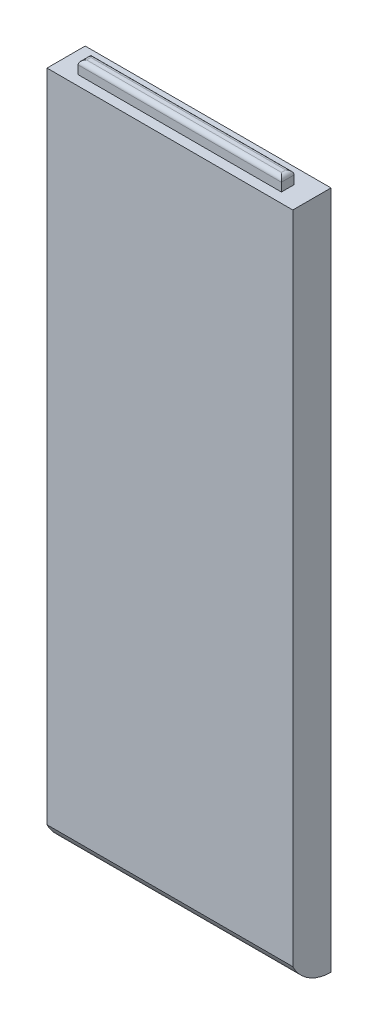
ISO-10303-21;
HEADER;
FILE_DESCRIPTION(('STEP AP214'),'2;1');
FILE_NAME('part.step','',(''),(''),'','','');
FILE_SCHEMA(('AUTOMOTIVE_DESIGN { 1 0 10303 214 1 1 1 1 }'));
ENDSEC;
DATA;
#1=APPLICATION_CONTEXT('core data for automotive mechanical design processes');
#2=APPLICATION_PROTOCOL_DEFINITION('international standard','automotive_design',2000,#1);
#3=PRODUCT_CONTEXT('',#1,'mechanical');
#4=PRODUCT('Part','Part','',(#3));
#5=PRODUCT_RELATED_PRODUCT_CATEGORY('part','',(#4));
#6=PRODUCT_DEFINITION_FORMATION('','',#4);
#7=PRODUCT_DEFINITION_CONTEXT('part definition',#1,'design');
#8=PRODUCT_DEFINITION('design','',#6,#7);
#9=PRODUCT_DEFINITION_SHAPE('','',#8);
#10=(LENGTH_UNIT() NAMED_UNIT(*) SI_UNIT(.MILLI.,.METRE.));
#11=(NAMED_UNIT(*) PLANE_ANGLE_UNIT() SI_UNIT($,.RADIAN.));
#12=(NAMED_UNIT(*) SI_UNIT($,.STERADIAN.) SOLID_ANGLE_UNIT());
#13=UNCERTAINTY_MEASURE_WITH_UNIT(LENGTH_MEASURE(1.E-05),#10,'distance_accuracy_value','');
#14=(GEOMETRIC_REPRESENTATION_CONTEXT(3) GLOBAL_UNCERTAINTY_ASSIGNED_CONTEXT((#13)) GLOBAL_UNIT_ASSIGNED_CONTEXT((#10,
#11,#12)) REPRESENTATION_CONTEXT('',''));
#15=CARTESIAN_POINT('',(0.,0.,0.));
#16=DIRECTION('',(0.,0.,1.));
#17=DIRECTION('',(1.,0.,0.));
#18=AXIS2_PLACEMENT_3D('',#15,#16,#17);
#19=CARTESIAN_POINT('',(0.,160.,10.));
#20=DIRECTION('',(0.,-1.,0.));
#21=DIRECTION('',(0.,0.,-1.));
#22=AXIS2_PLACEMENT_3D('',#19,#20,#21);
#23=PLANE('',#22);
#24=DIRECTION('',(0.,0.,1.));
#25=VECTOR('',#24,1.);
#26=CARTESIAN_POINT('',(4.99999999999997,160.,3.68090741163309));
#27=LINE('',#26,#25);
#28=CARTESIAN_POINT('',(4.99999999999997,160.,3.68090741163309));
#29=VERTEX_POINT('',#28);
#30=CARTESIAN_POINT('',(4.99999999999997,160.,6.68090741163309));
#31=VERTEX_POINT('',#30);
#32=EDGE_CURVE('E233',#29,#31,#27,.T.);
#33=ORIENTED_EDGE('',*,*,#32,.F.);
#34=DIRECTION('',(-1.,0.,0.));
#35=VECTOR('',#34,1.);
#36=CARTESIAN_POINT('',(4.99999999999997,160.,3.68090741163309));
#37=LINE('',#36,#35);
#38=CARTESIAN_POINT('',(52.9,160.,3.68090741163309));
#39=VERTEX_POINT('',#38);
#40=EDGE_CURVE('E248',#39,#29,#37,.T.);
#41=ORIENTED_EDGE('',*,*,#40,.F.);
#42=DIRECTION('',(0.,0.,-1.));
#43=VECTOR('',#42,1.);
#44=CARTESIAN_POINT('',(52.9,160.,3.68090741163309));
#45=LINE('',#44,#43);
#46=CARTESIAN_POINT('',(52.9,160.,6.68090741163309));
#47=VERTEX_POINT('',#46);
#48=EDGE_CURVE('E243',#47,#39,#45,.T.);
#49=ORIENTED_EDGE('',*,*,#48,.F.);
#50=DIRECTION('',(1.,0.,0.));
#51=VECTOR('',#50,1.);
#52=CARTESIAN_POINT('',(4.99999999999997,160.,6.68090741163309));
#53=LINE('',#52,#51);
#54=EDGE_CURVE('E238',#31,#47,#53,.T.);
#55=ORIENTED_EDGE('',*,*,#54,.F.);
#56=EDGE_LOOP('',(#33,#41,#49,#55));
#57=FACE_BOUND('',#56,.T.);
#58=DIRECTION('',(-1.,0.,0.));
#59=VECTOR('',#58,1.);
#60=CARTESIAN_POINT('',(0.,160.,9.));
#61=LINE('',#60,#59);
#62=CARTESIAN_POINT('',(57.9,160.,9.));
#63=VERTEX_POINT('',#62);
#64=CARTESIAN_POINT('',(0.,160.,9.));
#65=VERTEX_POINT('',#64);
#66=EDGE_CURVE('E152',#63,#65,#61,.T.);
#67=ORIENTED_EDGE('',*,*,#66,.F.);
#68=DIRECTION('',(0.,0.,-1.));
#69=VECTOR('',#68,1.);
#70=CARTESIAN_POINT('',(57.9,160.,10.));
#71=LINE('',#70,#69);
#72=CARTESIAN_POINT('',(57.9,160.,0.));
#73=VERTEX_POINT('',#72);
#74=EDGE_CURVE('E160',#63,#73,#71,.T.);
#75=ORIENTED_EDGE('',*,*,#74,.T.);
#76=DIRECTION('',(-1.,0.,0.));
#77=VECTOR('',#76,1.);
#78=CARTESIAN_POINT('',(0.,160.,0.));
#79=LINE('',#78,#77);
#80=CARTESIAN_POINT('',(0.,160.,0.));
#81=VERTEX_POINT('',#80);
#82=EDGE_CURVE('E173',#73,#81,#79,.T.);
#83=ORIENTED_EDGE('',*,*,#82,.T.);
#84=DIRECTION('',(0.,0.,-1.));
#85=VECTOR('',#84,1.);
#86=CARTESIAN_POINT('',(0.,160.,10.));
#87=LINE('',#86,#85);
#88=EDGE_CURVE('E162',#65,#81,#87,.T.);
#89=ORIENTED_EDGE('',*,*,#88,.F.);
#90=EDGE_LOOP('',(#67,#75,#83,#89));
#91=FACE_BOUND('',#90,.T.);
#92=ADVANCED_FACE('F39',(#57,#91),#23,.F.);
#93=CARTESIAN_POINT('',(0.,0.,10.));
#94=DIRECTION('',(1.,0.,0.));
#95=DIRECTION('',(0.,1.,0.));
#96=AXIS2_PLACEMENT_3D('',#93,#94,#95);
#97=PLANE('',#96);
#98=DIRECTION('',(0.,-1.,0.));
#99=VECTOR('',#98,1.);
#100=CARTESIAN_POINT('',(0.,160.,9.));
#101=LINE('',#100,#99);
#102=CARTESIAN_POINT('',(0.,5.64110105645933,9.));
#103=VERTEX_POINT('',#102);
#104=EDGE_CURVE('E54',#65,#103,#101,.T.);
#105=ORIENTED_EDGE('',*,*,#104,.F.);
#106=ORIENTED_EDGE('',*,*,#88,.T.);
#107=DIRECTION('',(0.,-1.,0.));
#108=VECTOR('',#107,1.);
#109=CARTESIAN_POINT('',(0.,0.,0.));
#110=LINE('',#109,#108);
#111=CARTESIAN_POINT('',(0.,0.,0.));
#112=VERTEX_POINT('',#111);
#113=EDGE_CURVE('E277',#81,#112,#110,.T.);
#114=ORIENTED_EDGE('',*,*,#113,.T.);
#115=CARTESIAN_POINT('',(0.,10.,0.));
#116=DIRECTION('',(1.,0.,0.));
#117=DIRECTION('',(0.,1.,0.));
#118=AXIS2_PLACEMENT_3D('',#115,#116,#117);
#119=CIRCLE('',#118,10.);
#120=EDGE_CURVE('E171',#112,#103,#119,.F.);
#121=ORIENTED_EDGE('',*,*,#120,.T.);
#122=EDGE_LOOP('',(#105,#106,#114,#121));
#123=FACE_BOUND('',#122,.T.);
#124=ADVANCED_FACE('F289',(#123),#97,.F.);
#125=CARTESIAN_POINT('',(57.9,0.,10.));
#126=DIRECTION('',(-1.,0.,0.));
#127=DIRECTION('',(0.,-1.,0.));
#128=AXIS2_PLACEMENT_3D('',#125,#126,#127);
#129=PLANE('',#128);
#130=DIRECTION('',(0.,1.,0.));
#131=VECTOR('',#130,1.);
#132=CARTESIAN_POINT('',(57.9,160.,9.));
#133=LINE('',#132,#131);
#134=CARTESIAN_POINT('',(57.9,5.64110105645932,9.));
#135=VERTEX_POINT('',#134);
#136=EDGE_CURVE('E149',#135,#63,#133,.T.);
#137=ORIENTED_EDGE('',*,*,#136,.F.);
#138=CARTESIAN_POINT('',(57.9,10.,0.));
#139=DIRECTION('',(-1.,0.,0.));
#140=DIRECTION('',(0.,-1.,0.));
#141=AXIS2_PLACEMENT_3D('',#138,#139,#140);
#142=CIRCLE('',#141,10.);
#143=CARTESIAN_POINT('',(57.9,0.,0.));
#144=VERTEX_POINT('',#143);
#145=EDGE_CURVE('E169',#135,#144,#142,.F.);
#146=ORIENTED_EDGE('',*,*,#145,.T.);
#147=DIRECTION('',(0.,1.,0.));
#148=VECTOR('',#147,1.);
#149=CARTESIAN_POINT('',(57.9,0.,0.));
#150=LINE('',#149,#148);
#151=EDGE_CURVE('E167',#144,#73,#150,.T.);
#152=ORIENTED_EDGE('',*,*,#151,.T.);
#153=ORIENTED_EDGE('',*,*,#74,.F.);
#154=EDGE_LOOP('',(#137,#146,#152,#153));
#155=FACE_BOUND('',#154,.T.);
#156=ADVANCED_FACE('F165',(#155),#129,.F.);
#157=CARTESIAN_POINT('',(0.,10.,0.));
#158=DIRECTION('',(1.,0.,0.));
#159=DIRECTION('',(0.,0.,-1.));
#160=AXIS2_PLACEMENT_3D('',#157,#158,#159);
#161=CYLINDRICAL_SURFACE('',#160,10.);
#162=ORIENTED_EDGE('',*,*,#145,.F.);
#163=DIRECTION('',(1.,0.,0.));
#164=VECTOR('',#163,1.);
#165=CARTESIAN_POINT('',(0.,5.64110105645933,9.));
#166=LINE('',#165,#164);
#167=EDGE_CURVE('E11',#135,#103,#166,.F.);
#168=ORIENTED_EDGE('',*,*,#167,.T.);
#169=ORIENTED_EDGE('',*,*,#120,.F.);
#170=DIRECTION('',(1.,0.,0.));
#171=VECTOR('',#170,1.);
#172=CARTESIAN_POINT('',(0.,0.,0.));
#173=LINE('',#172,#171);
#174=EDGE_CURVE('E280',#112,#144,#173,.T.);
#175=ORIENTED_EDGE('',*,*,#174,.T.);
#176=EDGE_LOOP('',(#162,#168,#169,#175));
#177=FACE_BOUND('',#176,.T.);
#178=ADVANCED_FACE('F291',(#177),#161,.T.);
#179=CARTESIAN_POINT('',(0.,0.,0.));
#180=DIRECTION('',(0.,0.,-1.));
#181=DIRECTION('',(-1.,0.,0.));
#182=AXIS2_PLACEMENT_3D('',#179,#180,#181);
#183=PLANE('',#182);
#184=ORIENTED_EDGE('',*,*,#113,.F.);
#185=ORIENTED_EDGE('',*,*,#82,.F.);
#186=ORIENTED_EDGE('',*,*,#151,.F.);
#187=ORIENTED_EDGE('',*,*,#174,.F.);
#188=EDGE_LOOP('',(#184,#185,#186,#187));
#189=FACE_BOUND('',#188,.T.);
#190=DIRECTION('',(-1.,0.,0.));
#191=VECTOR('',#190,1.);
#192=CARTESIAN_POINT('',(52.9,1.35,0.));
#193=LINE('',#192,#191);
#194=CARTESIAN_POINT('',(52.9,1.35,0.));
#195=VERTEX_POINT('',#194);
#196=CARTESIAN_POINT('',(4.99999999999997,1.35,0.));
#197=VERTEX_POINT('',#196);
#198=EDGE_CURVE('E260',#195,#197,#193,.T.);
#199=ORIENTED_EDGE('',*,*,#198,.F.);
#200=DIRECTION('',(0.,-1.,0.));
#201=VECTOR('',#200,1.);
#202=CARTESIAN_POINT('',(52.9,3.65,0.));
#203=LINE('',#202,#201);
#204=CARTESIAN_POINT('',(52.9,3.65,0.));
#205=VERTEX_POINT('',#204);
#206=EDGE_CURVE('E209',#205,#195,#203,.T.);
#207=ORIENTED_EDGE('',*,*,#206,.F.);
#208=DIRECTION('',(1.,0.,0.));
#209=VECTOR('',#208,1.);
#210=CARTESIAN_POINT('',(52.9,3.65,0.));
#211=LINE('',#210,#209);
#212=CARTESIAN_POINT('',(4.99999999999997,3.65,0.));
#213=VERTEX_POINT('',#212);
#214=EDGE_CURVE('E266',#213,#205,#211,.T.);
#215=ORIENTED_EDGE('',*,*,#214,.F.);
#216=DIRECTION('',(0.,1.,0.));
#217=VECTOR('',#216,1.);
#218=CARTESIAN_POINT('',(4.99999999999997,3.65,0.));
#219=LINE('',#218,#217);
#220=EDGE_CURVE('E263',#197,#213,#219,.T.);
#221=ORIENTED_EDGE('',*,*,#220,.F.);
#222=EDGE_LOOP('',(#199,#207,#215,#221));
#223=FACE_BOUND('',#222,.T.);
#224=ADVANCED_FACE('F285',(#189,#223),#183,.T.);
#225=CARTESIAN_POINT('',(52.9,3.65,-3.));
#226=DIRECTION('',(-1.,0.,0.));
#227=DIRECTION('',(0.,0.,1.));
#228=AXIS2_PLACEMENT_3D('',#225,#226,#227);
#229=PLANE('',#228);
#230=DIRECTION('',(0.,0.,1.));
#231=VECTOR('',#230,1.);
#232=CARTESIAN_POINT('',(52.9,1.35,-3.));
#233=LINE('',#232,#231);
#234=CARTESIAN_POINT('',(52.9,1.35,-2.));
#235=VERTEX_POINT('',#234);
#236=EDGE_CURVE('E275',#235,#195,#233,.T.);
#237=ORIENTED_EDGE('',*,*,#236,.F.);
#238=DIRECTION('',(0.,-1.,0.));
#239=VECTOR('',#238,1.);
#240=CARTESIAN_POINT('',(52.9,3.65,-2.));
#241=LINE('',#240,#239);
#242=CARTESIAN_POINT('',(52.9,3.65,-2.));
#243=VERTEX_POINT('',#242);
#244=EDGE_CURVE('E193',#235,#243,#241,.F.);
#245=ORIENTED_EDGE('',*,*,#244,.T.);
#246=DIRECTION('',(0.,0.,1.));
#247=VECTOR('',#246,1.);
#248=CARTESIAN_POINT('',(52.9,3.65,-3.));
#249=LINE('',#248,#247);
#250=EDGE_CURVE('E269',#243,#205,#249,.T.);
#251=ORIENTED_EDGE('',*,*,#250,.T.);
#252=ORIENTED_EDGE('',*,*,#206,.T.);
#253=EDGE_LOOP('',(#237,#245,#251,#252));
#254=FACE_BOUND('',#253,.T.);
#255=ADVANCED_FACE('F299',(#254),#229,.F.);
#256=CARTESIAN_POINT('',(52.9,1.35,-3.));
#257=DIRECTION('',(0.,1.,0.));
#258=DIRECTION('',(0.,0.,1.));
#259=AXIS2_PLACEMENT_3D('',#256,#257,#258);
#260=PLANE('',#259);
#261=DIRECTION('',(0.,0.,1.));
#262=VECTOR('',#261,1.);
#263=CARTESIAN_POINT('',(4.99999999999997,1.35,-3.));
#264=LINE('',#263,#262);
#265=CARTESIAN_POINT('',(4.99999999999997,1.35,-2.));
#266=VERTEX_POINT('',#265);
#267=EDGE_CURVE('E273',#266,#197,#264,.T.);
#268=ORIENTED_EDGE('',*,*,#267,.F.);
#269=DIRECTION('',(-1.,0.,0.));
#270=VECTOR('',#269,1.);
#271=CARTESIAN_POINT('',(52.9,1.35,-2.));
#272=LINE('',#271,#270);
#273=EDGE_CURVE('E191',#266,#235,#272,.F.);
#274=ORIENTED_EDGE('',*,*,#273,.T.);
#275=ORIENTED_EDGE('',*,*,#236,.T.);
#276=ORIENTED_EDGE('',*,*,#198,.T.);
#277=EDGE_LOOP('',(#268,#274,#275,#276));
#278=FACE_BOUND('',#277,.T.);
#279=ADVANCED_FACE('F314',(#278),#260,.F.);
#280=CARTESIAN_POINT('',(4.99999999999997,3.65,-3.));
#281=DIRECTION('',(1.,0.,0.));
#282=DIRECTION('',(0.,1.,0.));
#283=AXIS2_PLACEMENT_3D('',#280,#281,#282);
#284=PLANE('',#283);
#285=DIRECTION('',(0.,0.,1.));
#286=VECTOR('',#285,1.);
#287=CARTESIAN_POINT('',(4.99999999999997,3.65,-3.));
#288=LINE('',#287,#286);
#289=CARTESIAN_POINT('',(4.99999999999997,3.65,-2.));
#290=VERTEX_POINT('',#289);
#291=EDGE_CURVE('E271',#290,#213,#288,.T.);
#292=ORIENTED_EDGE('',*,*,#291,.F.);
#293=DIRECTION('',(0.,1.,0.));
#294=VECTOR('',#293,1.);
#295=CARTESIAN_POINT('',(4.99999999999997,1.35,-2.));
#296=LINE('',#295,#294);
#297=EDGE_CURVE('E188',#290,#266,#296,.F.);
#298=ORIENTED_EDGE('',*,*,#297,.T.);
#299=ORIENTED_EDGE('',*,*,#267,.T.);
#300=ORIENTED_EDGE('',*,*,#220,.T.);
#301=EDGE_LOOP('',(#292,#298,#299,#300));
#302=FACE_BOUND('',#301,.T.);
#303=ADVANCED_FACE('F318',(#302),#284,.F.);
#304=CARTESIAN_POINT('',(52.9,3.65,-3.));
#305=DIRECTION('',(0.,-1.,0.));
#306=DIRECTION('',(1.,0.,0.));
#307=AXIS2_PLACEMENT_3D('',#304,#305,#306);
#308=PLANE('',#307);
#309=ORIENTED_EDGE('',*,*,#250,.F.);
#310=DIRECTION('',(1.,0.,0.));
#311=VECTOR('',#310,1.);
#312=CARTESIAN_POINT('',(4.99999999999997,3.65,-2.));
#313=LINE('',#312,#311);
#314=EDGE_CURVE('E195',#243,#290,#313,.F.);
#315=ORIENTED_EDGE('',*,*,#314,.T.);
#316=ORIENTED_EDGE('',*,*,#291,.T.);
#317=ORIENTED_EDGE('',*,*,#214,.T.);
#318=EDGE_LOOP('',(#309,#315,#316,#317));
#319=FACE_BOUND('',#318,.T.);
#320=ADVANCED_FACE('F322',(#319),#308,.F.);
#321=CARTESIAN_POINT('',(0.,0.,-3.));
#322=DIRECTION('',(0.,0.,-1.));
#323=DIRECTION('',(-1.,0.,0.));
#324=AXIS2_PLACEMENT_3D('',#321,#322,#323);
#325=PLANE('',#324);
#326=DIRECTION('',(-1.,0.,0.));
#327=VECTOR('',#326,1.);
#328=CARTESIAN_POINT('',(4.99999999999997,2.35,-3.));
#329=LINE('',#328,#327);
#330=CARTESIAN_POINT('',(51.9,2.35,-3.));
#331=VERTEX_POINT('',#330);
#332=CARTESIAN_POINT('',(5.99999999999997,2.35,-3.));
#333=VERTEX_POINT('',#332);
#334=EDGE_CURVE('E183',#331,#333,#329,.T.);
#335=ORIENTED_EDGE('',*,*,#334,.T.);
#336=DIRECTION('',(0.,1.,0.));
#337=VECTOR('',#336,1.);
#338=CARTESIAN_POINT('',(5.99999999999997,3.65,-3.));
#339=LINE('',#338,#337);
#340=CARTESIAN_POINT('',(5.99999999999997,2.65,-3.));
#341=VERTEX_POINT('',#340);
#342=EDGE_CURVE('E185',#333,#341,#339,.T.);
#343=ORIENTED_EDGE('',*,*,#342,.T.);
#344=DIRECTION('',(1.,0.,0.));
#345=VECTOR('',#344,1.);
#346=CARTESIAN_POINT('',(52.9,2.65,-3.));
#347=LINE('',#346,#345);
#348=CARTESIAN_POINT('',(51.9,2.65,-3.));
#349=VERTEX_POINT('',#348);
#350=EDGE_CURVE('E179',#341,#349,#347,.T.);
#351=ORIENTED_EDGE('',*,*,#350,.T.);
#352=DIRECTION('',(0.,-1.,0.));
#353=VECTOR('',#352,1.);
#354=CARTESIAN_POINT('',(51.9,1.35,-3.));
#355=LINE('',#354,#353);
#356=EDGE_CURVE('E181',#349,#331,#355,.T.);
#357=ORIENTED_EDGE('',*,*,#356,.T.);
#358=EDGE_LOOP('',(#335,#343,#351,#357));
#359=FACE_BOUND('',#358,.T.);
#360=ADVANCED_FACE('F326',(#359),#325,.T.);
#361=CARTESIAN_POINT('',(51.9,0.,-2.));
#362=DIRECTION('',(0.,1.,0.));
#363=DIRECTION('',(0.,0.,1.));
#364=AXIS2_PLACEMENT_3D('',#361,#362,#363);
#365=CYLINDRICAL_SURFACE('',#364,1.);
#366=CARTESIAN_POINT('',(51.9,2.65,-2.));
#367=DIRECTION('',(-0.707106781186547,0.707106781186547,0.));
#368=DIRECTION('',(-0.707106781186547,-0.707106781186547,0.));
#369=AXIS2_PLACEMENT_3D('',#366,#367,#368);
#370=ELLIPSE('',#369,1.41421356237309,1.);
#371=EDGE_CURVE('E203',#243,#349,#370,.T.);
#372=ORIENTED_EDGE('',*,*,#371,.F.);
#373=ORIENTED_EDGE('',*,*,#244,.F.);
#374=CARTESIAN_POINT('',(51.9,2.35,-2.));
#375=DIRECTION('',(0.707106781186547,0.707106781186547,0.));
#376=DIRECTION('',(-0.707106781186547,0.707106781186547,0.));
#377=AXIS2_PLACEMENT_3D('',#374,#375,#376);
#378=ELLIPSE('',#377,1.41421356237309,1.);
#379=EDGE_CURVE('E206',#331,#235,#378,.F.);
#380=ORIENTED_EDGE('',*,*,#379,.F.);
#381=ORIENTED_EDGE('',*,*,#356,.F.);
#382=EDGE_LOOP('',(#372,#373,#380,#381));
#383=FACE_BOUND('',#382,.T.);
#384=ADVANCED_FACE('F330',(#383),#365,.T.);
#385=CARTESIAN_POINT('',(0.,2.35,-2.));
#386=DIRECTION('',(1.,0.,0.));
#387=DIRECTION('',(0.,0.,-1.));
#388=AXIS2_PLACEMENT_3D('',#385,#386,#387);
#389=CYLINDRICAL_SURFACE('',#388,1.);
#390=ORIENTED_EDGE('',*,*,#379,.T.);
#391=ORIENTED_EDGE('',*,*,#273,.F.);
#392=CARTESIAN_POINT('',(5.99999999999997,2.35,-2.));
#393=DIRECTION('',(0.707106781186547,-0.707106781186548,0.));
#394=DIRECTION('',(0.707106781186548,0.707106781186547,0.));
#395=AXIS2_PLACEMENT_3D('',#392,#393,#394);
#396=ELLIPSE('',#395,1.4142135623731,1.);
#397=EDGE_CURVE('E200',#333,#266,#396,.F.);
#398=ORIENTED_EDGE('',*,*,#397,.F.);
#399=ORIENTED_EDGE('',*,*,#334,.F.);
#400=EDGE_LOOP('',(#390,#391,#398,#399));
#401=FACE_BOUND('',#400,.T.);
#402=ADVANCED_FACE('F426',(#401),#389,.T.);
#403=CARTESIAN_POINT('',(0.,2.65,-2.));
#404=DIRECTION('',(-1.,0.,0.));
#405=DIRECTION('',(0.,-1.,0.));
#406=AXIS2_PLACEMENT_3D('',#403,#404,#405);
#407=CYLINDRICAL_SURFACE('',#406,1.);
#408=ORIENTED_EDGE('',*,*,#371,.T.);
#409=ORIENTED_EDGE('',*,*,#350,.F.);
#410=CARTESIAN_POINT('',(5.99999999999997,2.65,-2.));
#411=DIRECTION('',(-0.707106781186548,-0.707106781186547,0.));
#412=DIRECTION('',(-0.707106781186547,0.707106781186548,0.));
#413=AXIS2_PLACEMENT_3D('',#410,#411,#412);
#414=ELLIPSE('',#413,1.41421356237309,1.);
#415=EDGE_CURVE('E198',#290,#341,#414,.T.);
#416=ORIENTED_EDGE('',*,*,#415,.F.);
#417=ORIENTED_EDGE('',*,*,#314,.F.);
#418=EDGE_LOOP('',(#408,#409,#416,#417));
#419=FACE_BOUND('',#418,.T.);
#420=ADVANCED_FACE('F418',(#419),#407,.T.);
#421=CARTESIAN_POINT('',(5.99999999999997,0.,-2.));
#422=DIRECTION('',(0.,-1.,0.));
#423=DIRECTION('',(1.,0.,0.));
#424=AXIS2_PLACEMENT_3D('',#421,#422,#423);
#425=CYLINDRICAL_SURFACE('',#424,1.);
#426=ORIENTED_EDGE('',*,*,#397,.T.);
#427=ORIENTED_EDGE('',*,*,#297,.F.);
#428=ORIENTED_EDGE('',*,*,#415,.T.);
#429=ORIENTED_EDGE('',*,*,#342,.F.);
#430=EDGE_LOOP('',(#426,#427,#428,#429));
#431=FACE_BOUND('',#430,.T.);
#432=ADVANCED_FACE('F336',(#431),#425,.T.);
#433=CARTESIAN_POINT('',(4.99999999999997,163.,3.68090741163309));
#434=DIRECTION('',(1.,0.,0.));
#435=DIRECTION('',(0.,0.,-1.));
#436=AXIS2_PLACEMENT_3D('',#433,#434,#435);
#437=PLANE('',#436);
#438=DIRECTION('',(0.,-1.,0.));
#439=VECTOR('',#438,1.);
#440=CARTESIAN_POINT('',(4.99999999999997,163.,6.68090741163309));
#441=LINE('',#440,#439);
#442=CARTESIAN_POINT('',(4.99999999999997,162.,6.68090741163309));
#443=VERTEX_POINT('',#442);
#444=EDGE_CURVE('E201',#443,#31,#441,.T.);
#445=ORIENTED_EDGE('',*,*,#444,.F.);
#446=DIRECTION('',(0.,0.,1.));
#447=VECTOR('',#446,1.);
#448=CARTESIAN_POINT('',(4.99999999999997,162.,3.68090741163309));
#449=LINE('',#448,#447);
#450=CARTESIAN_POINT('',(4.99999999999997,162.,3.68090741163309));
#451=VERTEX_POINT('',#450);
#452=EDGE_CURVE('E223',#443,#451,#449,.F.);
#453=ORIENTED_EDGE('',*,*,#452,.T.);
#454=DIRECTION('',(0.,-1.,0.));
#455=VECTOR('',#454,1.);
#456=CARTESIAN_POINT('',(4.99999999999997,163.,3.68090741163309));
#457=LINE('',#456,#455);
#458=EDGE_CURVE('E251',#451,#29,#457,.T.);
#459=ORIENTED_EDGE('',*,*,#458,.T.);
#460=ORIENTED_EDGE('',*,*,#32,.T.);
#461=EDGE_LOOP('',(#445,#453,#459,#460));
#462=FACE_BOUND('',#461,.T.);
#463=ADVANCED_FACE('F332',(#462),#437,.F.);
#464=CARTESIAN_POINT('',(4.99999999999997,163.,6.68090741163309));
#465=DIRECTION('',(0.,0.,-1.));
#466=DIRECTION('',(-1.,0.,0.));
#467=AXIS2_PLACEMENT_3D('',#464,#465,#466);
#468=PLANE('',#467);
#469=DIRECTION('',(0.,-1.,0.));
#470=VECTOR('',#469,1.);
#471=CARTESIAN_POINT('',(52.9,163.,6.68090741163309));
#472=LINE('',#471,#470);
#473=CARTESIAN_POINT('',(52.9,162.,6.68090741163309));
#474=VERTEX_POINT('',#473);
#475=EDGE_CURVE('E255',#474,#47,#472,.T.);
#476=ORIENTED_EDGE('',*,*,#475,.F.);
#477=DIRECTION('',(1.,0.,0.));
#478=VECTOR('',#477,1.);
#479=CARTESIAN_POINT('',(4.99999999999997,162.,6.68090741163309));
#480=LINE('',#479,#478);
#481=EDGE_CURVE('E47',#474,#443,#480,.F.);
#482=ORIENTED_EDGE('',*,*,#481,.T.);
#483=ORIENTED_EDGE('',*,*,#444,.T.);
#484=ORIENTED_EDGE('',*,*,#54,.T.);
#485=EDGE_LOOP('',(#476,#482,#483,#484));
#486=FACE_BOUND('',#485,.T.);
#487=ADVANCED_FACE('F335',(#486),#468,.F.);
#488=CARTESIAN_POINT('',(52.9,163.,3.68090741163309));
#489=DIRECTION('',(-1.,0.,0.));
#490=DIRECTION('',(0.,0.,1.));
#491=AXIS2_PLACEMENT_3D('',#488,#489,#490);
#492=PLANE('',#491);
#493=DIRECTION('',(0.,-1.,0.));
#494=VECTOR('',#493,1.);
#495=CARTESIAN_POINT('',(52.9,163.,3.68090741163309));
#496=LINE('',#495,#494);
#497=CARTESIAN_POINT('',(52.9,162.,3.68090741163309));
#498=VERTEX_POINT('',#497);
#499=EDGE_CURVE('E253',#498,#39,#496,.T.);
#500=ORIENTED_EDGE('',*,*,#499,.F.);
#501=DIRECTION('',(0.,0.,-1.));
#502=VECTOR('',#501,1.);
#503=CARTESIAN_POINT('',(52.9,162.,6.68090741163309));
#504=LINE('',#503,#502);
#505=EDGE_CURVE('E218',#498,#474,#504,.F.);
#506=ORIENTED_EDGE('',*,*,#505,.T.);
#507=ORIENTED_EDGE('',*,*,#475,.T.);
#508=ORIENTED_EDGE('',*,*,#48,.T.);
#509=EDGE_LOOP('',(#500,#506,#507,#508));
#510=FACE_BOUND('',#509,.T.);
#511=ADVANCED_FACE('F339',(#510),#492,.F.);
#512=CARTESIAN_POINT('',(4.99999999999997,163.,3.68090741163309));
#513=DIRECTION('',(0.,0.,1.));
#514=DIRECTION('',(1.,0.,0.));
#515=AXIS2_PLACEMENT_3D('',#512,#513,#514);
#516=PLANE('',#515);
#517=ORIENTED_EDGE('',*,*,#458,.F.);
#518=DIRECTION('',(-1.,0.,0.));
#519=VECTOR('',#518,1.);
#520=CARTESIAN_POINT('',(52.9,162.,3.68090741163309));
#521=LINE('',#520,#519);
#522=EDGE_CURVE('E221',#451,#498,#521,.F.);
#523=ORIENTED_EDGE('',*,*,#522,.T.);
#524=ORIENTED_EDGE('',*,*,#499,.T.);
#525=ORIENTED_EDGE('',*,*,#40,.T.);
#526=EDGE_LOOP('',(#517,#523,#524,#525));
#527=FACE_BOUND('',#526,.T.);
#528=ADVANCED_FACE('F342',(#527),#516,.F.);
#529=CARTESIAN_POINT('',(0.,163.,0.));
#530=DIRECTION('',(0.,1.,0.));
#531=DIRECTION('',(0.,0.,1.));
#532=AXIS2_PLACEMENT_3D('',#529,#530,#531);
#533=PLANE('',#532);
#534=DIRECTION('',(1.,0.,0.));
#535=VECTOR('',#534,1.);
#536=CARTESIAN_POINT('',(52.9,163.,5.68090741163309));
#537=LINE('',#536,#535);
#538=CARTESIAN_POINT('',(5.99999999999997,163.,5.68090741163309));
#539=VERTEX_POINT('',#538);
#540=CARTESIAN_POINT('',(51.9,163.,5.68090741163309));
#541=VERTEX_POINT('',#540);
#542=EDGE_CURVE('E197',#539,#541,#537,.T.);
#543=ORIENTED_EDGE('',*,*,#542,.T.);
#544=DIRECTION('',(0.,0.,-1.));
#545=VECTOR('',#544,1.);
#546=CARTESIAN_POINT('',(51.9,163.,3.68090741163309));
#547=LINE('',#546,#545);
#548=CARTESIAN_POINT('',(51.9,163.,4.68090741163309));
#549=VERTEX_POINT('',#548);
#550=EDGE_CURVE('E215',#541,#549,#547,.T.);
#551=ORIENTED_EDGE('',*,*,#550,.T.);
#552=DIRECTION('',(-1.,0.,0.));
#553=VECTOR('',#552,1.);
#554=CARTESIAN_POINT('',(4.99999999999997,163.,4.68090741163309));
#555=LINE('',#554,#553);
#556=CARTESIAN_POINT('',(5.99999999999997,163.,4.68090741163309));
#557=VERTEX_POINT('',#556);
#558=EDGE_CURVE('E213',#549,#557,#555,.T.);
#559=ORIENTED_EDGE('',*,*,#558,.T.);
#560=DIRECTION('',(0.,0.,1.));
#561=VECTOR('',#560,1.);
#562=CARTESIAN_POINT('',(5.99999999999997,163.,6.68090741163309));
#563=LINE('',#562,#561);
#564=EDGE_CURVE('E211',#557,#539,#563,.T.);
#565=ORIENTED_EDGE('',*,*,#564,.T.);
#566=EDGE_LOOP('',(#543,#551,#559,#565));
#567=FACE_BOUND('',#566,.T.);
#568=ADVANCED_FACE('F346',(#567),#533,.T.);
#569=CARTESIAN_POINT('',(5.99999999999997,162.,0.));
#570=DIRECTION('',(0.,0.,-1.));
#571=DIRECTION('',(-1.,0.,0.));
#572=AXIS2_PLACEMENT_3D('',#569,#570,#571);
#573=CYLINDRICAL_SURFACE('',#572,1.);
#574=CARTESIAN_POINT('',(5.99999999999997,162.,4.68090741163309));
#575=DIRECTION('',(0.707106781186547,0.,-0.707106781186547));
#576=DIRECTION('',(-0.707106781186547,0.,-0.707106781186547));
#577=AXIS2_PLACEMENT_3D('',#574,#575,#576);
#578=ELLIPSE('',#577,1.41421356237309,1.);
#579=EDGE_CURVE('E229',#451,#557,#578,.T.);
#580=ORIENTED_EDGE('',*,*,#579,.F.);
#581=ORIENTED_EDGE('',*,*,#452,.F.);
#582=CARTESIAN_POINT('',(5.99999999999997,162.,5.68090741163309));
#583=DIRECTION('',(-0.707106781186547,0.,-0.707106781186547));
#584=DIRECTION('',(-0.707106781186547,0.,0.707106781186547));
#585=AXIS2_PLACEMENT_3D('',#582,#583,#584);
#586=ELLIPSE('',#585,1.41421356237309,1.);
#587=EDGE_CURVE('E231',#539,#443,#586,.F.);
#588=ORIENTED_EDGE('',*,*,#587,.F.);
#589=ORIENTED_EDGE('',*,*,#564,.F.);
#590=EDGE_LOOP('',(#580,#581,#588,#589));
#591=FACE_BOUND('',#590,.T.);
#592=ADVANCED_FACE('F41',(#591),#573,.T.);
#593=CARTESIAN_POINT('',(0.,162.,5.68090741163309));
#594=DIRECTION('',(-1.,0.,0.));
#595=DIRECTION('',(0.,0.,1.));
#596=AXIS2_PLACEMENT_3D('',#593,#594,#595);
#597=CYLINDRICAL_SURFACE('',#596,1.);
#598=ORIENTED_EDGE('',*,*,#587,.T.);
#599=ORIENTED_EDGE('',*,*,#481,.F.);
#600=CARTESIAN_POINT('',(51.9,162.,5.68090741163309));
#601=DIRECTION('',(-0.707106781186547,0.,0.707106781186547));
#602=DIRECTION('',(-0.707106781186547,0.,-0.707106781186547));
#603=AXIS2_PLACEMENT_3D('',#600,#601,#602);
#604=ELLIPSE('',#603,1.41421356237309,1.);
#605=EDGE_CURVE('E227',#541,#474,#604,.F.);
#606=ORIENTED_EDGE('',*,*,#605,.F.);
#607=ORIENTED_EDGE('',*,*,#542,.F.);
#608=EDGE_LOOP('',(#598,#599,#606,#607));
#609=FACE_BOUND('',#608,.T.);
#610=ADVANCED_FACE('F360',(#609),#597,.T.);
#611=CARTESIAN_POINT('',(0.,162.,4.68090741163309));
#612=DIRECTION('',(1.,0.,0.));
#613=DIRECTION('',(0.,0.,-1.));
#614=AXIS2_PLACEMENT_3D('',#611,#612,#613);
#615=CYLINDRICAL_SURFACE('',#614,1.);
#616=ORIENTED_EDGE('',*,*,#579,.T.);
#617=ORIENTED_EDGE('',*,*,#558,.F.);
#618=CARTESIAN_POINT('',(51.9,162.,4.68090741163309));
#619=DIRECTION('',(0.707106781186547,0.,0.707106781186547));
#620=DIRECTION('',(0.707106781186547,0.,-0.707106781186547));
#621=AXIS2_PLACEMENT_3D('',#618,#619,#620);
#622=ELLIPSE('',#621,1.41421356237309,1.);
#623=EDGE_CURVE('E163',#498,#549,#622,.T.);
#624=ORIENTED_EDGE('',*,*,#623,.F.);
#625=ORIENTED_EDGE('',*,*,#522,.F.);
#626=EDGE_LOOP('',(#616,#617,#624,#625));
#627=FACE_BOUND('',#626,.T.);
#628=ADVANCED_FACE('F354',(#627),#615,.T.);
#629=CARTESIAN_POINT('',(51.9,162.,0.));
#630=DIRECTION('',(0.,0.,1.));
#631=DIRECTION('',(1.,0.,0.));
#632=AXIS2_PLACEMENT_3D('',#629,#630,#631);
#633=CYLINDRICAL_SURFACE('',#632,1.);
#634=ORIENTED_EDGE('',*,*,#605,.T.);
#635=ORIENTED_EDGE('',*,*,#505,.F.);
#636=ORIENTED_EDGE('',*,*,#623,.T.);
#637=ORIENTED_EDGE('',*,*,#550,.F.);
#638=EDGE_LOOP('',(#634,#635,#636,#637));
#639=FACE_BOUND('',#638,.T.);
#640=ADVANCED_FACE('F351',(#639),#633,.T.);
#641=CARTESIAN_POINT('',(0.,0.,9.));
#642=DIRECTION('',(0.,0.,1.));
#643=DIRECTION('',(1.,0.,0.));
#644=AXIS2_PLACEMENT_3D('',#641,#642,#643);
#645=PLANE('',#644);
#646=ORIENTED_EDGE('',*,*,#136,.T.);
#647=ORIENTED_EDGE('',*,*,#66,.T.);
#648=ORIENTED_EDGE('',*,*,#104,.T.);
#649=ORIENTED_EDGE('',*,*,#167,.F.);
#650=EDGE_LOOP('',(#646,#647,#648,#649));
#651=FACE_BOUND('',#650,.T.);
#652=ADVANCED_FACE('F151',(#651),#645,.T.);
#653=CLOSED_SHELL('',(#92,#124,#156,#178,#224,#255,#279,#303,#320,#360,#384,#402,#420,#432,#463,
#487,#511,#528,#568,#592,#610,#628,#640,#652));
#654=MANIFOLD_SOLID_BREP('B2',#653);
#655=ADVANCED_BREP_SHAPE_REPRESENTATION('',(#18,#654),#14);
#656=SHAPE_DEFINITION_REPRESENTATION(#9,#655);
ENDSEC;
END-ISO-10303-21;
